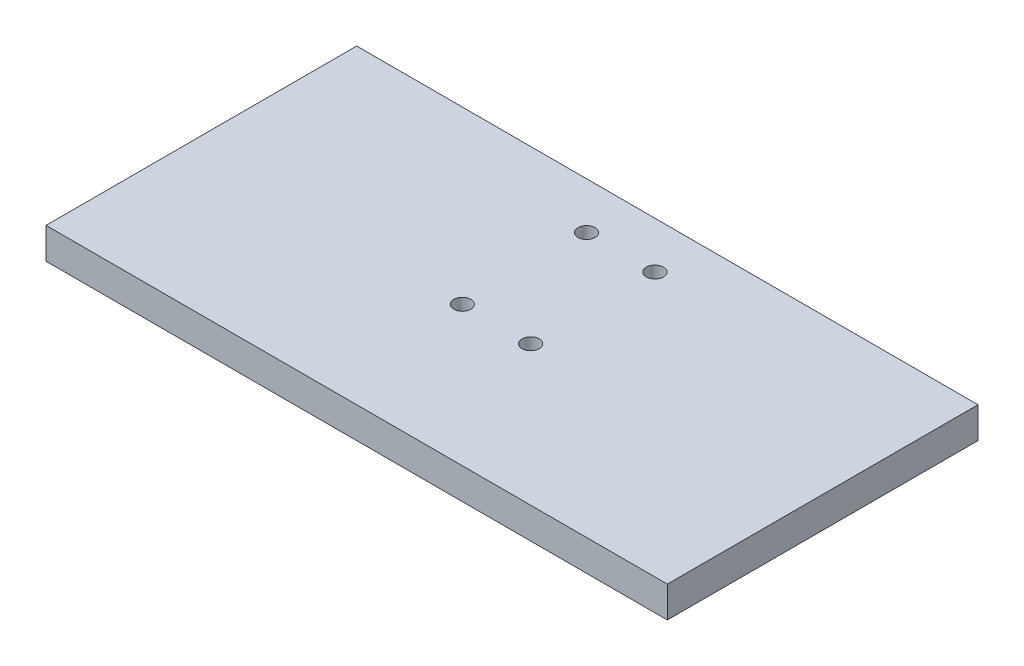
ISO-10303-21;
HEADER;
FILE_DESCRIPTION(('STEP AP214'),'2;1');
FILE_NAME('part.step','',(''),(''),'','','');
FILE_SCHEMA(('AUTOMOTIVE_DESIGN { 1 0 10303 214 1 1 1 1 }'));
ENDSEC;
DATA;
#1=APPLICATION_CONTEXT('core data for automotive mechanical design processes');
#2=APPLICATION_PROTOCOL_DEFINITION('international standard','automotive_design',2000,#1);
#3=PRODUCT_CONTEXT('',#1,'mechanical');
#4=PRODUCT('Part','Part','',(#3));
#5=PRODUCT_RELATED_PRODUCT_CATEGORY('part','',(#4));
#6=PRODUCT_DEFINITION_FORMATION('','',#4);
#7=PRODUCT_DEFINITION_CONTEXT('part definition',#1,'design');
#8=PRODUCT_DEFINITION('design','',#6,#7);
#9=PRODUCT_DEFINITION_SHAPE('','',#8);
#10=(LENGTH_UNIT() NAMED_UNIT(*) SI_UNIT(.MILLI.,.METRE.));
#11=(NAMED_UNIT(*) PLANE_ANGLE_UNIT() SI_UNIT($,.RADIAN.));
#12=(NAMED_UNIT(*) SI_UNIT($,.STERADIAN.) SOLID_ANGLE_UNIT());
#13=UNCERTAINTY_MEASURE_WITH_UNIT(LENGTH_MEASURE(1.E-05),#10,'distance_accuracy_value','');
#14=(GEOMETRIC_REPRESENTATION_CONTEXT(3) GLOBAL_UNCERTAINTY_ASSIGNED_CONTEXT((#13)) GLOBAL_UNIT_ASSIGNED_CONTEXT((#10,
#11,#12)) REPRESENTATION_CONTEXT('',''));
#15=CARTESIAN_POINT('',(0.,0.,0.));
#16=DIRECTION('',(0.,0.,1.));
#17=DIRECTION('',(1.,0.,0.));
#18=AXIS2_PLACEMENT_3D('',#15,#16,#17);
#19=CARTESIAN_POINT('',(0.,10.,0.));
#20=DIRECTION('',(1.,0.,0.));
#21=DIRECTION('',(0.,0.,-1.));
#22=AXIS2_PLACEMENT_3D('',#19,#20,#21);
#23=PLANE('',#22);
#24=DIRECTION('',(0.,0.,1.));
#25=VECTOR('',#24,1.);
#26=CARTESIAN_POINT('',(0.,0.,0.));
#27=LINE('',#26,#25);
#28=CARTESIAN_POINT('',(0.,0.,-100.));
#29=VERTEX_POINT('',#28);
#30=CARTESIAN_POINT('',(0.,0.,0.));
#31=VERTEX_POINT('',#30);
#32=EDGE_CURVE('E96',#29,#31,#27,.T.);
#33=ORIENTED_EDGE('',*,*,#32,.T.);
#34=DIRECTION('',(0.,-1.,0.));
#35=VECTOR('',#34,1.);
#36=CARTESIAN_POINT('',(0.,10.,0.));
#37=LINE('',#36,#35);
#38=CARTESIAN_POINT('',(0.,10.,0.));
#39=VERTEX_POINT('',#38);
#40=EDGE_CURVE('E11',#39,#31,#37,.T.);
#41=ORIENTED_EDGE('',*,*,#40,.F.);
#42=DIRECTION('',(0.,0.,1.));
#43=VECTOR('',#42,1.);
#44=CARTESIAN_POINT('',(0.,10.,0.));
#45=LINE('',#44,#43);
#46=CARTESIAN_POINT('',(0.,10.,-100.));
#47=VERTEX_POINT('',#46);
#48=EDGE_CURVE('E84',#47,#39,#45,.T.);
#49=ORIENTED_EDGE('',*,*,#48,.F.);
#50=DIRECTION('',(0.,-1.,0.));
#51=VECTOR('',#50,1.);
#52=CARTESIAN_POINT('',(0.,10.,-100.));
#53=LINE('',#52,#51);
#54=EDGE_CURVE('E92',#47,#29,#53,.T.);
#55=ORIENTED_EDGE('',*,*,#54,.T.);
#56=EDGE_LOOP('',(#33,#41,#49,#55));
#57=FACE_BOUND('',#56,.T.);
#58=ADVANCED_FACE('F33',(#57),#23,.F.);
#59=CARTESIAN_POINT('',(0.,10.,0.));
#60=DIRECTION('',(0.,0.,-1.));
#61=DIRECTION('',(-1.,0.,0.));
#62=AXIS2_PLACEMENT_3D('',#59,#60,#61);
#63=PLANE('',#62);
#64=DIRECTION('',(1.,0.,0.));
#65=VECTOR('',#64,1.);
#66=CARTESIAN_POINT('',(0.,0.,0.));
#67=LINE('',#66,#65);
#68=CARTESIAN_POINT('',(200.,0.,0.));
#69=VERTEX_POINT('',#68);
#70=EDGE_CURVE('E88',#31,#69,#67,.T.);
#71=ORIENTED_EDGE('',*,*,#70,.T.);
#72=DIRECTION('',(0.,-1.,0.));
#73=VECTOR('',#72,1.);
#74=CARTESIAN_POINT('',(200.,10.,0.));
#75=LINE('',#74,#73);
#76=CARTESIAN_POINT('',(200.,10.,0.));
#77=VERTEX_POINT('',#76);
#78=EDGE_CURVE('E41',#77,#69,#75,.T.);
#79=ORIENTED_EDGE('',*,*,#78,.F.);
#80=DIRECTION('',(1.,0.,0.));
#81=VECTOR('',#80,1.);
#82=CARTESIAN_POINT('',(0.,10.,0.));
#83=LINE('',#82,#81);
#84=EDGE_CURVE('E79',#39,#77,#83,.T.);
#85=ORIENTED_EDGE('',*,*,#84,.F.);
#86=ORIENTED_EDGE('',*,*,#40,.T.);
#87=EDGE_LOOP('',(#71,#79,#85,#86));
#88=FACE_BOUND('',#87,.T.);
#89=ADVANCED_FACE('F87',(#88),#63,.F.);
#90=CARTESIAN_POINT('',(200.,10.,0.));
#91=DIRECTION('',(-1.,0.,0.));
#92=DIRECTION('',(0.,0.,1.));
#93=AXIS2_PLACEMENT_3D('',#90,#91,#92);
#94=PLANE('',#93);
#95=DIRECTION('',(0.,0.,-1.));
#96=VECTOR('',#95,1.);
#97=CARTESIAN_POINT('',(200.,0.,0.));
#98=LINE('',#97,#96);
#99=CARTESIAN_POINT('',(200.,0.,-100.));
#100=VERTEX_POINT('',#99);
#101=EDGE_CURVE('E66',#69,#100,#98,.T.);
#102=ORIENTED_EDGE('',*,*,#101,.T.);
#103=DIRECTION('',(0.,-1.,0.));
#104=VECTOR('',#103,1.);
#105=CARTESIAN_POINT('',(200.,10.,-100.));
#106=LINE('',#105,#104);
#107=CARTESIAN_POINT('',(200.,10.,-100.));
#108=VERTEX_POINT('',#107);
#109=EDGE_CURVE('E89',#108,#100,#106,.T.);
#110=ORIENTED_EDGE('',*,*,#109,.F.);
#111=DIRECTION('',(0.,0.,-1.));
#112=VECTOR('',#111,1.);
#113=CARTESIAN_POINT('',(200.,10.,0.));
#114=LINE('',#113,#112);
#115=EDGE_CURVE('E82',#77,#108,#114,.T.);
#116=ORIENTED_EDGE('',*,*,#115,.F.);
#117=ORIENTED_EDGE('',*,*,#78,.T.);
#118=EDGE_LOOP('',(#102,#110,#116,#117));
#119=FACE_BOUND('',#118,.T.);
#120=ADVANCED_FACE('F90',(#119),#94,.F.);
#121=CARTESIAN_POINT('',(0.,10.,-100.));
#122=DIRECTION('',(0.,0.,1.));
#123=DIRECTION('',(1.,0.,0.));
#124=AXIS2_PLACEMENT_3D('',#121,#122,#123);
#125=PLANE('',#124);
#126=DIRECTION('',(-1.,0.,0.));
#127=VECTOR('',#126,1.);
#128=CARTESIAN_POINT('',(0.,0.,-100.));
#129=LINE('',#128,#127);
#130=EDGE_CURVE('E72',#100,#29,#129,.T.);
#131=ORIENTED_EDGE('',*,*,#130,.T.);
#132=ORIENTED_EDGE('',*,*,#54,.F.);
#133=DIRECTION('',(-1.,0.,0.));
#134=VECTOR('',#133,1.);
#135=CARTESIAN_POINT('',(0.,10.,-100.));
#136=LINE('',#135,#134);
#137=EDGE_CURVE('E49',#108,#47,#136,.T.);
#138=ORIENTED_EDGE('',*,*,#137,.F.);
#139=ORIENTED_EDGE('',*,*,#109,.T.);
#140=EDGE_LOOP('',(#131,#132,#138,#139));
#141=FACE_BOUND('',#140,.T.);
#142=ADVANCED_FACE('F104',(#141),#125,.F.);
#143=CARTESIAN_POINT('',(0.,10.,0.));
#144=DIRECTION('',(0.,-1.,0.));
#145=DIRECTION('',(0.,0.,-1.));
#146=AXIS2_PLACEMENT_3D('',#143,#144,#145);
#147=PLANE('',#146);
#148=CARTESIAN_POINT('',(89.,10.,-45.));
#149=DIRECTION('',(0.,-1.,0.));
#150=DIRECTION('',(0.,0.,-1.));
#151=AXIS2_PLACEMENT_3D('',#148,#149,#150);
#152=CIRCLE('',#151,2.75);
#153=CARTESIAN_POINT('',(89.,10.,-47.75));
#154=VERTEX_POINT('',#153);
#155=EDGE_CURVE('E145',#154,#154,#152,.T.);
#156=ORIENTED_EDGE('',*,*,#155,.T.);
#157=EDGE_LOOP('',(#156));
#158=FACE_BOUND('',#157,.T.);
#159=CARTESIAN_POINT('',(111.,10.,-45.));
#160=DIRECTION('',(0.,-1.,0.));
#161=DIRECTION('',(0.,0.,-1.));
#162=AXIS2_PLACEMENT_3D('',#159,#160,#161);
#163=CIRCLE('',#162,2.75);
#164=CARTESIAN_POINT('',(111.,10.,-47.75));
#165=VERTEX_POINT('',#164);
#166=EDGE_CURVE('E133',#165,#165,#163,.T.);
#167=ORIENTED_EDGE('',*,*,#166,.T.);
#168=EDGE_LOOP('',(#167));
#169=FACE_BOUND('',#168,.T.);
#170=CARTESIAN_POINT('',(111.,10.,-85.));
#171=DIRECTION('',(0.,-1.,0.));
#172=DIRECTION('',(0.,0.,-1.));
#173=AXIS2_PLACEMENT_3D('',#170,#171,#172);
#174=CIRCLE('',#173,2.75);
#175=CARTESIAN_POINT('',(111.,10.,-87.75));
#176=VERTEX_POINT('',#175);
#177=EDGE_CURVE('E121',#176,#176,#174,.T.);
#178=ORIENTED_EDGE('',*,*,#177,.T.);
#179=EDGE_LOOP('',(#178));
#180=FACE_BOUND('',#179,.T.);
#181=CARTESIAN_POINT('',(89.0000000000001,10.,-85.));
#182=DIRECTION('',(0.,-1.,0.));
#183=DIRECTION('',(0.,0.,-1.));
#184=AXIS2_PLACEMENT_3D('',#181,#182,#183);
#185=CIRCLE('',#184,2.75);
#186=CARTESIAN_POINT('',(89.0000000000001,10.,-87.75));
#187=VERTEX_POINT('',#186);
#188=EDGE_CURVE('E99',#187,#187,#185,.T.);
#189=ORIENTED_EDGE('',*,*,#188,.T.);
#190=EDGE_LOOP('',(#189));
#191=FACE_BOUND('',#190,.T.);
#192=ORIENTED_EDGE('',*,*,#48,.T.);
#193=ORIENTED_EDGE('',*,*,#84,.T.);
#194=ORIENTED_EDGE('',*,*,#115,.T.);
#195=ORIENTED_EDGE('',*,*,#137,.T.);
#196=EDGE_LOOP('',(#192,#193,#194,#195));
#197=FACE_BOUND('',#196,.T.);
#198=ADVANCED_FACE('F80',(#158,#169,#180,#191,#197),#147,.F.);
#199=CARTESIAN_POINT('',(0.,0.,0.));
#200=DIRECTION('',(0.,-1.,0.));
#201=DIRECTION('',(0.,0.,-1.));
#202=AXIS2_PLACEMENT_3D('',#199,#200,#201);
#203=PLANE('',#202);
#204=CARTESIAN_POINT('',(89.,0.,-45.));
#205=DIRECTION('',(0.,-1.,0.));
#206=DIRECTION('',(0.,0.,-1.));
#207=AXIS2_PLACEMENT_3D('',#204,#205,#206);
#208=CIRCLE('',#207,4.75);
#209=CARTESIAN_POINT('',(89.,0.,-49.75));
#210=VERTEX_POINT('',#209);
#211=EDGE_CURVE('E154',#210,#210,#208,.T.);
#212=ORIENTED_EDGE('',*,*,#211,.F.);
#213=EDGE_LOOP('',(#212));
#214=FACE_BOUND('',#213,.T.);
#215=CARTESIAN_POINT('',(111.,0.,-45.));
#216=DIRECTION('',(0.,-1.,0.));
#217=DIRECTION('',(0.,0.,-1.));
#218=AXIS2_PLACEMENT_3D('',#215,#216,#217);
#219=CIRCLE('',#218,4.75);
#220=CARTESIAN_POINT('',(111.,0.,-49.75));
#221=VERTEX_POINT('',#220);
#222=EDGE_CURVE('E142',#221,#221,#219,.T.);
#223=ORIENTED_EDGE('',*,*,#222,.F.);
#224=EDGE_LOOP('',(#223));
#225=FACE_BOUND('',#224,.T.);
#226=CARTESIAN_POINT('',(111.,0.,-85.));
#227=DIRECTION('',(0.,-1.,0.));
#228=DIRECTION('',(0.,0.,-1.));
#229=AXIS2_PLACEMENT_3D('',#226,#227,#228);
#230=CIRCLE('',#229,4.75);
#231=CARTESIAN_POINT('',(111.,0.,-89.75));
#232=VERTEX_POINT('',#231);
#233=EDGE_CURVE('E130',#232,#232,#230,.T.);
#234=ORIENTED_EDGE('',*,*,#233,.F.);
#235=EDGE_LOOP('',(#234));
#236=FACE_BOUND('',#235,.T.);
#237=CARTESIAN_POINT('',(89.0000000000001,0.,-85.));
#238=DIRECTION('',(0.,-1.,0.));
#239=DIRECTION('',(0.,0.,-1.));
#240=AXIS2_PLACEMENT_3D('',#237,#238,#239);
#241=CIRCLE('',#240,4.75);
#242=CARTESIAN_POINT('',(89.0000000000001,0.,-89.75));
#243=VERTEX_POINT('',#242);
#244=EDGE_CURVE('E118',#243,#243,#241,.T.);
#245=ORIENTED_EDGE('',*,*,#244,.F.);
#246=EDGE_LOOP('',(#245));
#247=FACE_BOUND('',#246,.T.);
#248=ORIENTED_EDGE('',*,*,#32,.F.);
#249=ORIENTED_EDGE('',*,*,#130,.F.);
#250=ORIENTED_EDGE('',*,*,#101,.F.);
#251=ORIENTED_EDGE('',*,*,#70,.F.);
#252=EDGE_LOOP('',(#248,#249,#250,#251));
#253=FACE_BOUND('',#252,.T.);
#254=ADVANCED_FACE('F107',(#214,#225,#236,#247,#253),#203,.T.);
#255=CARTESIAN_POINT('',(89.0000000000001,0.,-85.));
#256=DIRECTION('',(0.,-1.,0.));
#257=DIRECTION('',(0.,0.,-1.));
#258=AXIS2_PLACEMENT_3D('',#255,#256,#257);
#259=CYLINDRICAL_SURFACE('',#258,2.75);
#260=ORIENTED_EDGE('',*,*,#188,.F.);
#261=EDGE_LOOP('',(#260));
#262=FACE_BOUND('',#261,.T.);
#263=CARTESIAN_POINT('',(89.0000000000001,3.3,-85.));
#264=DIRECTION('',(0.,-1.,0.));
#265=DIRECTION('',(0.,0.,-1.));
#266=AXIS2_PLACEMENT_3D('',#263,#264,#265);
#267=CIRCLE('',#266,2.75);
#268=CARTESIAN_POINT('',(89.0000000000001,3.3,-87.75));
#269=VERTEX_POINT('',#268);
#270=EDGE_CURVE('E112',#269,#269,#267,.T.);
#271=ORIENTED_EDGE('',*,*,#270,.T.);
#272=EDGE_LOOP('',(#271));
#273=FACE_BOUND('',#272,.T.);
#274=ADVANCED_FACE('F162',(#262,#273),#259,.F.);
#275=CARTESIAN_POINT('',(91.7500000000002,3.3,-85.));
#276=DIRECTION('',(0.,1.,0.));
#277=DIRECTION('',(0.,0.,1.));
#278=AXIS2_PLACEMENT_3D('',#275,#276,#277);
#279=PLANE('',#278);
#280=ORIENTED_EDGE('',*,*,#270,.F.);
#281=EDGE_LOOP('',(#280));
#282=FACE_BOUND('',#281,.T.);
#283=CARTESIAN_POINT('',(89.0000000000001,3.3,-85.));
#284=DIRECTION('',(0.,-1.,0.));
#285=DIRECTION('',(0.,0.,-1.));
#286=AXIS2_PLACEMENT_3D('',#283,#284,#285);
#287=CIRCLE('',#286,4.75);
#288=CARTESIAN_POINT('',(89.0000000000001,3.3,-89.75));
#289=VERTEX_POINT('',#288);
#290=EDGE_CURVE('E115',#289,#289,#287,.T.);
#291=ORIENTED_EDGE('',*,*,#290,.T.);
#292=EDGE_LOOP('',(#291));
#293=FACE_BOUND('',#292,.T.);
#294=ADVANCED_FACE('F173',(#282,#293),#279,.F.);
#295=CARTESIAN_POINT('',(89.0000000000001,0.,-85.));
#296=DIRECTION('',(0.,-1.,0.));
#297=DIRECTION('',(0.,0.,-1.));
#298=AXIS2_PLACEMENT_3D('',#295,#296,#297);
#299=CYLINDRICAL_SURFACE('',#298,4.75);
#300=ORIENTED_EDGE('',*,*,#290,.F.);
#301=EDGE_LOOP('',(#300));
#302=FACE_BOUND('',#301,.T.);
#303=ORIENTED_EDGE('',*,*,#244,.T.);
#304=EDGE_LOOP('',(#303));
#305=FACE_BOUND('',#304,.T.);
#306=ADVANCED_FACE('F170',(#302,#305),#299,.F.);
#307=CARTESIAN_POINT('',(111.,0.,-85.));
#308=DIRECTION('',(0.,-1.,0.));
#309=DIRECTION('',(0.,0.,-1.));
#310=AXIS2_PLACEMENT_3D('',#307,#308,#309);
#311=CYLINDRICAL_SURFACE('',#310,2.75);
#312=ORIENTED_EDGE('',*,*,#177,.F.);
#313=EDGE_LOOP('',(#312));
#314=FACE_BOUND('',#313,.T.);
#315=CARTESIAN_POINT('',(111.,3.3,-85.));
#316=DIRECTION('',(0.,-1.,0.));
#317=DIRECTION('',(0.,0.,-1.));
#318=AXIS2_PLACEMENT_3D('',#315,#316,#317);
#319=CIRCLE('',#318,2.75);
#320=CARTESIAN_POINT('',(111.,3.3,-87.75));
#321=VERTEX_POINT('',#320);
#322=EDGE_CURVE('E124',#321,#321,#319,.T.);
#323=ORIENTED_EDGE('',*,*,#322,.T.);
#324=EDGE_LOOP('',(#323));
#325=FACE_BOUND('',#324,.T.);
#326=ADVANCED_FACE('F172',(#314,#325),#311,.F.);
#327=CARTESIAN_POINT('',(113.75,3.3,-85.));
#328=DIRECTION('',(0.,1.,0.));
#329=DIRECTION('',(0.,0.,1.));
#330=AXIS2_PLACEMENT_3D('',#327,#328,#329);
#331=PLANE('',#330);
#332=ORIENTED_EDGE('',*,*,#322,.F.);
#333=EDGE_LOOP('',(#332));
#334=FACE_BOUND('',#333,.T.);
#335=CARTESIAN_POINT('',(111.,3.3,-85.));
#336=DIRECTION('',(0.,-1.,0.));
#337=DIRECTION('',(0.,0.,-1.));
#338=AXIS2_PLACEMENT_3D('',#335,#336,#337);
#339=CIRCLE('',#338,4.75);
#340=CARTESIAN_POINT('',(111.,3.3,-89.75));
#341=VERTEX_POINT('',#340);
#342=EDGE_CURVE('E127',#341,#341,#339,.T.);
#343=ORIENTED_EDGE('',*,*,#342,.T.);
#344=EDGE_LOOP('',(#343));
#345=FACE_BOUND('',#344,.T.);
#346=ADVANCED_FACE('F180',(#334,#345),#331,.F.);
#347=CARTESIAN_POINT('',(111.,0.,-85.));
#348=DIRECTION('',(0.,-1.,0.));
#349=DIRECTION('',(0.,0.,-1.));
#350=AXIS2_PLACEMENT_3D('',#347,#348,#349);
#351=CYLINDRICAL_SURFACE('',#350,4.75);
#352=ORIENTED_EDGE('',*,*,#342,.F.);
#353=EDGE_LOOP('',(#352));
#354=FACE_BOUND('',#353,.T.);
#355=ORIENTED_EDGE('',*,*,#233,.T.);
#356=EDGE_LOOP('',(#355));
#357=FACE_BOUND('',#356,.T.);
#358=ADVANCED_FACE('F234',(#354,#357),#351,.F.);
#359=CARTESIAN_POINT('',(111.,0.,-45.));
#360=DIRECTION('',(0.,-1.,0.));
#361=DIRECTION('',(0.,0.,-1.));
#362=AXIS2_PLACEMENT_3D('',#359,#360,#361);
#363=CYLINDRICAL_SURFACE('',#362,2.75);
#364=ORIENTED_EDGE('',*,*,#166,.F.);
#365=EDGE_LOOP('',(#364));
#366=FACE_BOUND('',#365,.T.);
#367=CARTESIAN_POINT('',(111.,3.3,-45.));
#368=DIRECTION('',(0.,-1.,0.));
#369=DIRECTION('',(0.,0.,-1.));
#370=AXIS2_PLACEMENT_3D('',#367,#368,#369);
#371=CIRCLE('',#370,2.75);
#372=CARTESIAN_POINT('',(111.,3.3,-47.75));
#373=VERTEX_POINT('',#372);
#374=EDGE_CURVE('E136',#373,#373,#371,.T.);
#375=ORIENTED_EDGE('',*,*,#374,.T.);
#376=EDGE_LOOP('',(#375));
#377=FACE_BOUND('',#376,.T.);
#378=ADVANCED_FACE('F244',(#366,#377),#363,.F.);
#379=CARTESIAN_POINT('',(113.75,3.3,-45.));
#380=DIRECTION('',(0.,1.,0.));
#381=DIRECTION('',(0.,0.,1.));
#382=AXIS2_PLACEMENT_3D('',#379,#380,#381);
#383=PLANE('',#382);
#384=ORIENTED_EDGE('',*,*,#374,.F.);
#385=EDGE_LOOP('',(#384));
#386=FACE_BOUND('',#385,.T.);
#387=CARTESIAN_POINT('',(111.,3.3,-45.));
#388=DIRECTION('',(0.,-1.,0.));
#389=DIRECTION('',(0.,0.,-1.));
#390=AXIS2_PLACEMENT_3D('',#387,#388,#389);
#391=CIRCLE('',#390,4.75);
#392=CARTESIAN_POINT('',(111.,3.3,-49.75));
#393=VERTEX_POINT('',#392);
#394=EDGE_CURVE('E139',#393,#393,#391,.T.);
#395=ORIENTED_EDGE('',*,*,#394,.T.);
#396=EDGE_LOOP('',(#395));
#397=FACE_BOUND('',#396,.T.);
#398=ADVANCED_FACE('F254',(#386,#397),#383,.F.);
#399=CARTESIAN_POINT('',(111.,0.,-45.));
#400=DIRECTION('',(0.,-1.,0.));
#401=DIRECTION('',(0.,0.,-1.));
#402=AXIS2_PLACEMENT_3D('',#399,#400,#401);
#403=CYLINDRICAL_SURFACE('',#402,4.75);
#404=ORIENTED_EDGE('',*,*,#394,.F.);
#405=EDGE_LOOP('',(#404));
#406=FACE_BOUND('',#405,.T.);
#407=ORIENTED_EDGE('',*,*,#222,.T.);
#408=EDGE_LOOP('',(#407));
#409=FACE_BOUND('',#408,.T.);
#410=ADVANCED_FACE('F264',(#406,#409),#403,.F.);
#411=CARTESIAN_POINT('',(89.,0.,-45.));
#412=DIRECTION('',(0.,-1.,0.));
#413=DIRECTION('',(0.,0.,-1.));
#414=AXIS2_PLACEMENT_3D('',#411,#412,#413);
#415=CYLINDRICAL_SURFACE('',#414,2.75);
#416=ORIENTED_EDGE('',*,*,#155,.F.);
#417=EDGE_LOOP('',(#416));
#418=FACE_BOUND('',#417,.T.);
#419=CARTESIAN_POINT('',(89.,3.3,-45.));
#420=DIRECTION('',(0.,-1.,0.));
#421=DIRECTION('',(0.,0.,-1.));
#422=AXIS2_PLACEMENT_3D('',#419,#420,#421);
#423=CIRCLE('',#422,2.75);
#424=CARTESIAN_POINT('',(89.,3.3,-47.75));
#425=VERTEX_POINT('',#424);
#426=EDGE_CURVE('E148',#425,#425,#423,.T.);
#427=ORIENTED_EDGE('',*,*,#426,.T.);
#428=EDGE_LOOP('',(#427));
#429=FACE_BOUND('',#428,.T.);
#430=ADVANCED_FACE('F274',(#418,#429),#415,.F.);
#431=CARTESIAN_POINT('',(91.75,3.3,-45.));
#432=DIRECTION('',(0.,1.,0.));
#433=DIRECTION('',(0.,0.,1.));
#434=AXIS2_PLACEMENT_3D('',#431,#432,#433);
#435=PLANE('',#434);
#436=ORIENTED_EDGE('',*,*,#426,.F.);
#437=EDGE_LOOP('',(#436));
#438=FACE_BOUND('',#437,.T.);
#439=CARTESIAN_POINT('',(89.,3.3,-45.));
#440=DIRECTION('',(0.,-1.,0.));
#441=DIRECTION('',(0.,0.,-1.));
#442=AXIS2_PLACEMENT_3D('',#439,#440,#441);
#443=CIRCLE('',#442,4.75);
#444=CARTESIAN_POINT('',(89.,3.3,-49.75));
#445=VERTEX_POINT('',#444);
#446=EDGE_CURVE('E151',#445,#445,#443,.T.);
#447=ORIENTED_EDGE('',*,*,#446,.T.);
#448=EDGE_LOOP('',(#447));
#449=FACE_BOUND('',#448,.T.);
#450=ADVANCED_FACE('F284',(#438,#449),#435,.F.);
#451=CARTESIAN_POINT('',(89.,0.,-45.));
#452=DIRECTION('',(0.,-1.,0.));
#453=DIRECTION('',(0.,0.,-1.));
#454=AXIS2_PLACEMENT_3D('',#451,#452,#453);
#455=CYLINDRICAL_SURFACE('',#454,4.75);
#456=ORIENTED_EDGE('',*,*,#446,.F.);
#457=EDGE_LOOP('',(#456));
#458=FACE_BOUND('',#457,.T.);
#459=ORIENTED_EDGE('',*,*,#211,.T.);
#460=EDGE_LOOP('',(#459));
#461=FACE_BOUND('',#460,.T.);
#462=ADVANCED_FACE('F158',(#458,#461),#455,.F.);
#463=CLOSED_SHELL('',(#58,#89,#120,#142,#198,#254,#274,#294,#306,#326,#346,#358,#378,#398,#410,
#430,#450,#462));
#464=MANIFOLD_SOLID_BREP('B2',#463);
#465=ADVANCED_BREP_SHAPE_REPRESENTATION('',(#18,#464),#14);
#466=SHAPE_DEFINITION_REPRESENTATION(#9,#465);
ENDSEC;
END-ISO-10303-21;
